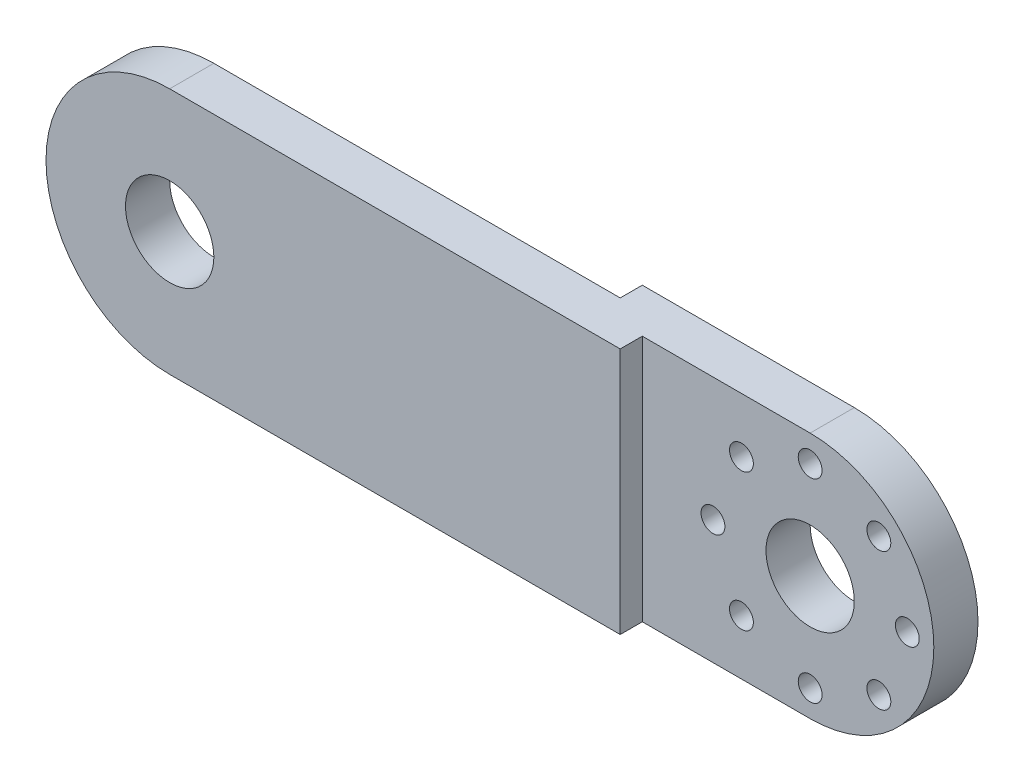
ISO-10303-21;
HEADER;
FILE_DESCRIPTION(('STEP AP214'),'2;1');
FILE_NAME('part.step','',(''),(''),'','','');
FILE_SCHEMA(('AUTOMOTIVE_DESIGN { 1 0 10303 214 1 1 1 1 }'));
ENDSEC;
DATA;
#1=APPLICATION_CONTEXT('core data for automotive mechanical design processes');
#2=APPLICATION_PROTOCOL_DEFINITION('international standard','automotive_design',2000,#1);
#3=PRODUCT_CONTEXT('',#1,'mechanical');
#4=PRODUCT('Part','Part','',(#3));
#5=PRODUCT_RELATED_PRODUCT_CATEGORY('part','',(#4));
#6=PRODUCT_DEFINITION_FORMATION('','',#4);
#7=PRODUCT_DEFINITION_CONTEXT('part definition',#1,'design');
#8=PRODUCT_DEFINITION('design','',#6,#7);
#9=PRODUCT_DEFINITION_SHAPE('','',#8);
#10=(LENGTH_UNIT() NAMED_UNIT(*) SI_UNIT(.MILLI.,.METRE.));
#11=(NAMED_UNIT(*) PLANE_ANGLE_UNIT() SI_UNIT($,.RADIAN.));
#12=(NAMED_UNIT(*) SI_UNIT($,.STERADIAN.) SOLID_ANGLE_UNIT());
#13=UNCERTAINTY_MEASURE_WITH_UNIT(LENGTH_MEASURE(1.E-05),#10,'distance_accuracy_value','');
#14=(GEOMETRIC_REPRESENTATION_CONTEXT(3) GLOBAL_UNCERTAINTY_ASSIGNED_CONTEXT((#13)) GLOBAL_UNIT_ASSIGNED_CONTEXT((#10,
#11,#12)) REPRESENTATION_CONTEXT('',''));
#15=CARTESIAN_POINT('',(0.,0.,0.));
#16=DIRECTION('',(0.,0.,1.));
#17=DIRECTION('',(1.,0.,0.));
#18=AXIS2_PLACEMENT_3D('',#15,#16,#17);
#19=CARTESIAN_POINT('',(0.,0.,5.));
#20=DIRECTION('',(0.,0.,1.));
#21=DIRECTION('',(1.,0.,0.));
#22=AXIS2_PLACEMENT_3D('',#19,#20,#21);
#23=PLANE('',#22);
#24=CARTESIAN_POINT('',(50.,0.,5.));
#25=DIRECTION('',(0.,0.,1.));
#26=DIRECTION('',(1.,0.,0.));
#27=AXIS2_PLACEMENT_3D('',#24,#25,#26);
#28=CIRCLE('',#27,5.);
#29=CARTESIAN_POINT('',(55.,0.,5.));
#30=VERTEX_POINT('',#29);
#31=EDGE_CURVE('E376',#30,#30,#28,.T.);
#32=ORIENTED_EDGE('',*,*,#31,.F.);
#33=EDGE_LOOP('',(#32));
#34=FACE_BOUND('',#33,.T.);
#35=CARTESIAN_POINT('',(50.,0.,5.));
#36=DIRECTION('',(0.,0.,1.));
#37=DIRECTION('',(1.,0.,0.));
#38=AXIS2_PLACEMENT_3D('',#35,#36,#37);
#39=CIRCLE('',#38,14.);
#40=CARTESIAN_POINT('',(50.,14.,5.));
#41=VERTEX_POINT('',#40);
#42=CARTESIAN_POINT('',(50.,-14.,5.));
#43=VERTEX_POINT('',#42);
#44=EDGE_CURVE('E96',#41,#43,#39,.T.);
#45=ORIENTED_EDGE('',*,*,#44,.T.);
#46=DIRECTION('',(1.,0.,0.));
#47=VECTOR('',#46,1.);
#48=CARTESIAN_POINT('',(0.,-14.,5.));
#49=LINE('',#48,#47);
#50=CARTESIAN_POINT('',(101.,-14.,5.));
#51=VERTEX_POINT('',#50);
#52=EDGE_CURVE('E90',#43,#51,#49,.T.);
#53=ORIENTED_EDGE('',*,*,#52,.T.);
#54=DIRECTION('',(0.,-1.,0.));
#55=VECTOR('',#54,1.);
#56=CARTESIAN_POINT('',(101.,14.,5.));
#57=LINE('',#56,#55);
#58=CARTESIAN_POINT('',(101.,14.,5.));
#59=VERTEX_POINT('',#58);
#60=EDGE_CURVE('E92',#59,#51,#57,.T.);
#61=ORIENTED_EDGE('',*,*,#60,.F.);
#62=DIRECTION('',(-1.,0.,0.));
#63=VECTOR('',#62,1.);
#64=CARTESIAN_POINT('',(0.,14.,5.));
#65=LINE('',#64,#63);
#66=EDGE_CURVE('E48',#59,#41,#65,.T.);
#67=ORIENTED_EDGE('',*,*,#66,.T.);
#68=EDGE_LOOP('',(#45,#53,#61,#67));
#69=FACE_BOUND('',#68,.T.);
#70=ADVANCED_FACE('F38',(#34,#69),#23,.T.);
#71=CARTESIAN_POINT('',(0.,0.,0.));
#72=DIRECTION('',(0.,0.,1.));
#73=DIRECTION('',(1.,0.,0.));
#74=AXIS2_PLACEMENT_3D('',#71,#72,#73);
#75=PLANE('',#74);
#76=CARTESIAN_POINT('',(50.,0.,0.));
#77=DIRECTION('',(0.,0.,-1.));
#78=DIRECTION('',(-1.,0.,0.));
#79=AXIS2_PLACEMENT_3D('',#76,#77,#78);
#80=CIRCLE('',#79,5.);
#81=CARTESIAN_POINT('',(45.,0.,0.));
#82=VERTEX_POINT('',#81);
#83=EDGE_CURVE('E379',#82,#82,#80,.T.);
#84=ORIENTED_EDGE('',*,*,#83,.F.);
#85=EDGE_LOOP('',(#84));
#86=FACE_BOUND('',#85,.T.);
#87=DIRECTION('',(1.,0.,0.));
#88=VECTOR('',#87,1.);
#89=CARTESIAN_POINT('',(0.,-14.,0.));
#90=LINE('',#89,#88);
#91=CARTESIAN_POINT('',(50.,-14.,0.));
#92=VERTEX_POINT('',#91);
#93=CARTESIAN_POINT('',(96.,-14.,0.));
#94=VERTEX_POINT('',#93);
#95=EDGE_CURVE('E184',#92,#94,#90,.T.);
#96=ORIENTED_EDGE('',*,*,#95,.F.);
#97=CARTESIAN_POINT('',(50.,0.,0.));
#98=DIRECTION('',(0.,0.,1.));
#99=DIRECTION('',(1.,0.,0.));
#100=AXIS2_PLACEMENT_3D('',#97,#98,#99);
#101=CIRCLE('',#100,14.);
#102=CARTESIAN_POINT('',(50.,14.,0.));
#103=VERTEX_POINT('',#102);
#104=EDGE_CURVE('E287',#103,#92,#101,.T.);
#105=ORIENTED_EDGE('',*,*,#104,.F.);
#106=DIRECTION('',(-1.,0.,0.));
#107=VECTOR('',#106,1.);
#108=CARTESIAN_POINT('',(0.,14.,0.));
#109=LINE('',#108,#107);
#110=CARTESIAN_POINT('',(96.,14.,0.));
#111=VERTEX_POINT('',#110);
#112=EDGE_CURVE('E100',#111,#103,#109,.T.);
#113=ORIENTED_EDGE('',*,*,#112,.F.);
#114=DIRECTION('',(0.,-1.,0.));
#115=VECTOR('',#114,1.);
#116=CARTESIAN_POINT('',(96.,14.,0.));
#117=LINE('',#116,#115);
#118=EDGE_CURVE('E118',#111,#94,#117,.T.);
#119=ORIENTED_EDGE('',*,*,#118,.T.);
#120=EDGE_LOOP('',(#96,#105,#113,#119));
#121=FACE_BOUND('',#120,.T.);
#122=ADVANCED_FACE('F247',(#86,#121),#75,.F.);
#123=CARTESIAN_POINT('',(0.,-14.,5.));
#124=DIRECTION('',(0.,1.,0.));
#125=DIRECTION('',(0.,0.,1.));
#126=AXIS2_PLACEMENT_3D('',#123,#124,#125);
#127=PLANE('',#126);
#128=DIRECTION('',(0.,0.,-1.));
#129=VECTOR('',#128,1.);
#130=CARTESIAN_POINT('',(50.,-14.,10.));
#131=LINE('',#130,#129);
#132=EDGE_CURVE('E11',#92,#43,#131,.F.);
#133=ORIENTED_EDGE('',*,*,#132,.F.);
#134=ORIENTED_EDGE('',*,*,#95,.T.);
#135=DIRECTION('',(0.,0.,-1.));
#136=VECTOR('',#135,1.);
#137=CARTESIAN_POINT('',(96.,-14.,-2.5));
#138=LINE('',#137,#136);
#139=CARTESIAN_POINT('',(96.,-14.,-2.5));
#140=VERTEX_POINT('',#139);
#141=EDGE_CURVE('E299',#94,#140,#138,.T.);
#142=ORIENTED_EDGE('',*,*,#141,.T.);
#143=DIRECTION('',(-1.,0.,0.));
#144=VECTOR('',#143,1.);
#145=CARTESIAN_POINT('',(101.,-14.,-2.5));
#146=LINE('',#145,#144);
#147=CARTESIAN_POINT('',(120.,-14.,-2.5));
#148=VERTEX_POINT('',#147);
#149=EDGE_CURVE('E177',#148,#140,#146,.T.);
#150=ORIENTED_EDGE('',*,*,#149,.F.);
#151=DIRECTION('',(0.,0.,-1.));
#152=VECTOR('',#151,1.);
#153=CARTESIAN_POINT('',(120.,-14.,2.5));
#154=LINE('',#153,#152);
#155=CARTESIAN_POINT('',(120.,-14.,2.5));
#156=VERTEX_POINT('',#155);
#157=EDGE_CURVE('E56',#156,#148,#154,.T.);
#158=ORIENTED_EDGE('',*,*,#157,.F.);
#159=DIRECTION('',(-1.,0.,0.));
#160=VECTOR('',#159,1.);
#161=CARTESIAN_POINT('',(106.,-14.,2.5));
#162=LINE('',#161,#160);
#163=CARTESIAN_POINT('',(101.,-14.,2.5));
#164=VERTEX_POINT('',#163);
#165=EDGE_CURVE('E110',#156,#164,#162,.T.);
#166=ORIENTED_EDGE('',*,*,#165,.T.);
#167=DIRECTION('',(0.,0.,1.));
#168=VECTOR('',#167,1.);
#169=CARTESIAN_POINT('',(101.,-14.,2.5));
#170=LINE('',#169,#168);
#171=EDGE_CURVE('E104',#164,#51,#170,.T.);
#172=ORIENTED_EDGE('',*,*,#171,.T.);
#173=ORIENTED_EDGE('',*,*,#52,.F.);
#174=EDGE_LOOP('',(#133,#134,#142,#150,#158,#166,#172,#173));
#175=FACE_BOUND('',#174,.T.);
#176=ADVANCED_FACE('F40',(#175),#127,.F.);
#177=CARTESIAN_POINT('',(0.,14.,5.));
#178=DIRECTION('',(0.,-1.,0.));
#179=DIRECTION('',(0.,0.,-1.));
#180=AXIS2_PLACEMENT_3D('',#177,#178,#179);
#181=PLANE('',#180);
#182=ORIENTED_EDGE('',*,*,#112,.T.);
#183=DIRECTION('',(0.,0.,1.));
#184=VECTOR('',#183,1.);
#185=CARTESIAN_POINT('',(50.,14.,-2.5));
#186=LINE('',#185,#184);
#187=EDGE_CURVE('E275',#103,#41,#186,.T.);
#188=ORIENTED_EDGE('',*,*,#187,.T.);
#189=ORIENTED_EDGE('',*,*,#66,.F.);
#190=DIRECTION('',(0.,0.,1.));
#191=VECTOR('',#190,1.);
#192=CARTESIAN_POINT('',(101.,14.,2.5));
#193=LINE('',#192,#191);
#194=CARTESIAN_POINT('',(101.,14.,2.5));
#195=VERTEX_POINT('',#194);
#196=EDGE_CURVE('E77',#195,#59,#193,.T.);
#197=ORIENTED_EDGE('',*,*,#196,.F.);
#198=DIRECTION('',(1.,0.,0.));
#199=VECTOR('',#198,1.);
#200=CARTESIAN_POINT('',(106.,14.,2.5));
#201=LINE('',#200,#199);
#202=CARTESIAN_POINT('',(120.,14.,2.5));
#203=VERTEX_POINT('',#202);
#204=EDGE_CURVE('E161',#195,#203,#201,.T.);
#205=ORIENTED_EDGE('',*,*,#204,.T.);
#206=DIRECTION('',(0.,0.,-1.));
#207=VECTOR('',#206,1.);
#208=CARTESIAN_POINT('',(120.,14.,2.5));
#209=LINE('',#208,#207);
#210=CARTESIAN_POINT('',(120.,14.,-2.5));
#211=VERTEX_POINT('',#210);
#212=EDGE_CURVE('E171',#203,#211,#209,.T.);
#213=ORIENTED_EDGE('',*,*,#212,.T.);
#214=DIRECTION('',(1.,0.,0.));
#215=VECTOR('',#214,1.);
#216=CARTESIAN_POINT('',(106.,14.,-2.5));
#217=LINE('',#216,#215);
#218=CARTESIAN_POINT('',(96.,14.,-2.5));
#219=VERTEX_POINT('',#218);
#220=EDGE_CURVE('E68',#219,#211,#217,.T.);
#221=ORIENTED_EDGE('',*,*,#220,.F.);
#222=DIRECTION('',(0.,0.,-1.));
#223=VECTOR('',#222,1.);
#224=CARTESIAN_POINT('',(96.,14.,-2.5));
#225=LINE('',#224,#223);
#226=EDGE_CURVE('E278',#111,#219,#225,.T.);
#227=ORIENTED_EDGE('',*,*,#226,.F.);
#228=EDGE_LOOP('',(#182,#188,#189,#197,#205,#213,#221,#227));
#229=FACE_BOUND('',#228,.T.);
#230=ADVANCED_FACE('F260',(#229),#181,.F.);
#231=CARTESIAN_POINT('',(0.,0.,-2.5));
#232=DIRECTION('',(0.,0.,1.));
#233=DIRECTION('',(1.,0.,0.));
#234=AXIS2_PLACEMENT_3D('',#231,#232,#233);
#235=PLANE('',#234);
#236=CARTESIAN_POINT('',(131.,0.,-2.5));
#237=DIRECTION('',(0.,0.,-1.));
#238=DIRECTION('',(-1.,0.,0.));
#239=AXIS2_PLACEMENT_3D('',#236,#237,#238);
#240=CIRCLE('',#239,1.34999999999998);
#241=CARTESIAN_POINT('',(129.65,0.,-2.5));
#242=VERTEX_POINT('',#241);
#243=EDGE_CURVE('E129',#242,#242,#240,.T.);
#244=ORIENTED_EDGE('',*,*,#243,.F.);
#245=EDGE_LOOP('',(#244));
#246=FACE_BOUND('',#245,.T.);
#247=CARTESIAN_POINT('',(120.,-11.,-2.5));
#248=DIRECTION('',(0.,0.,-1.));
#249=DIRECTION('',(-1.,0.,0.));
#250=AXIS2_PLACEMENT_3D('',#247,#248,#249);
#251=CIRCLE('',#250,1.35000000000001);
#252=CARTESIAN_POINT('',(118.65,-11.,-2.5));
#253=VERTEX_POINT('',#252);
#254=EDGE_CURVE('E141',#253,#253,#251,.T.);
#255=ORIENTED_EDGE('',*,*,#254,.F.);
#256=EDGE_LOOP('',(#255));
#257=FACE_BOUND('',#256,.T.);
#258=CARTESIAN_POINT('',(109.,0.,-2.5));
#259=DIRECTION('',(0.,0.,-1.));
#260=DIRECTION('',(-1.,0.,0.));
#261=AXIS2_PLACEMENT_3D('',#258,#259,#260);
#262=CIRCLE('',#261,1.35000000000001);
#263=CARTESIAN_POINT('',(107.65,0.,-2.5));
#264=VERTEX_POINT('',#263);
#265=EDGE_CURVE('E145',#264,#264,#262,.T.);
#266=ORIENTED_EDGE('',*,*,#265,.F.);
#267=EDGE_LOOP('',(#266));
#268=FACE_BOUND('',#267,.T.);
#269=CARTESIAN_POINT('',(120.,11.,-2.5));
#270=DIRECTION('',(0.,0.,-1.));
#271=DIRECTION('',(-1.,0.,0.));
#272=AXIS2_PLACEMENT_3D('',#269,#270,#271);
#273=CIRCLE('',#272,1.35000000000001);
#274=CARTESIAN_POINT('',(118.65,11.,-2.5));
#275=VERTEX_POINT('',#274);
#276=EDGE_CURVE('E149',#275,#275,#273,.T.);
#277=ORIENTED_EDGE('',*,*,#276,.F.);
#278=EDGE_LOOP('',(#277));
#279=FACE_BOUND('',#278,.T.);
#280=CARTESIAN_POINT('',(112.221825406948,7.77817459305201,-2.5));
#281=DIRECTION('',(0.,0.,-1.));
#282=DIRECTION('',(-1.,0.,0.));
#283=AXIS2_PLACEMENT_3D('',#280,#281,#282);
#284=CIRCLE('',#283,1.35000000000001);
#285=CARTESIAN_POINT('',(110.871825406948,7.77817459305201,-2.5));
#286=VERTEX_POINT('',#285);
#287=EDGE_CURVE('E125',#286,#286,#284,.T.);
#288=ORIENTED_EDGE('',*,*,#287,.F.);
#289=EDGE_LOOP('',(#288));
#290=FACE_BOUND('',#289,.T.);
#291=CARTESIAN_POINT('',(112.221825406948,-7.77817459305183,-2.5));
#292=DIRECTION('',(0.,0.,-1.));
#293=DIRECTION('',(-1.,0.,0.));
#294=AXIS2_PLACEMENT_3D('',#291,#292,#293);
#295=CIRCLE('',#294,1.35000000000001);
#296=CARTESIAN_POINT('',(110.871825406948,-7.77817459305183,-2.5));
#297=VERTEX_POINT('',#296);
#298=EDGE_CURVE('E130',#297,#297,#295,.T.);
#299=ORIENTED_EDGE('',*,*,#298,.F.);
#300=EDGE_LOOP('',(#299));
#301=FACE_BOUND('',#300,.T.);
#302=CARTESIAN_POINT('',(127.778174593052,-7.77817459305202,-2.5));
#303=DIRECTION('',(0.,0.,-1.));
#304=DIRECTION('',(-1.,0.,0.));
#305=AXIS2_PLACEMENT_3D('',#302,#303,#304);
#306=CIRCLE('',#305,1.34999999999998);
#307=CARTESIAN_POINT('',(126.428174593052,-7.77817459305202,-2.5));
#308=VERTEX_POINT('',#307);
#309=EDGE_CURVE('E134',#308,#308,#306,.T.);
#310=ORIENTED_EDGE('',*,*,#309,.F.);
#311=EDGE_LOOP('',(#310));
#312=FACE_BOUND('',#311,.T.);
#313=CARTESIAN_POINT('',(127.778174593052,7.77817459305201,-2.5));
#314=DIRECTION('',(0.,0.,-1.));
#315=DIRECTION('',(-1.,0.,0.));
#316=AXIS2_PLACEMENT_3D('',#313,#314,#315);
#317=CIRCLE('',#316,1.34999999999998);
#318=CARTESIAN_POINT('',(126.428174593052,7.77817459305201,-2.5));
#319=VERTEX_POINT('',#318);
#320=EDGE_CURVE('E124',#319,#319,#317,.T.);
#321=ORIENTED_EDGE('',*,*,#320,.F.);
#322=EDGE_LOOP('',(#321));
#323=FACE_BOUND('',#322,.T.);
#324=CARTESIAN_POINT('',(120.,0.,-2.5));
#325=DIRECTION('',(0.,0.,-1.));
#326=DIRECTION('',(-1.,0.,0.));
#327=AXIS2_PLACEMENT_3D('',#324,#325,#326);
#328=CIRCLE('',#327,5.);
#329=CARTESIAN_POINT('',(115.,0.,-2.5));
#330=VERTEX_POINT('',#329);
#331=EDGE_CURVE('E153',#330,#330,#328,.T.);
#332=ORIENTED_EDGE('',*,*,#331,.F.);
#333=EDGE_LOOP('',(#332));
#334=FACE_BOUND('',#333,.T.);
#335=ORIENTED_EDGE('',*,*,#220,.T.);
#336=CARTESIAN_POINT('',(120.,0.,-2.5));
#337=DIRECTION('',(0.,0.,-1.));
#338=DIRECTION('',(-1.,0.,0.));
#339=AXIS2_PLACEMENT_3D('',#336,#337,#338);
#340=CIRCLE('',#339,14.);
#341=EDGE_CURVE('E166',#211,#148,#340,.T.);
#342=ORIENTED_EDGE('',*,*,#341,.T.);
#343=ORIENTED_EDGE('',*,*,#149,.T.);
#344=DIRECTION('',(0.,-1.,0.));
#345=VECTOR('',#344,1.);
#346=CARTESIAN_POINT('',(96.,14.,-2.5));
#347=LINE('',#346,#345);
#348=EDGE_CURVE('E112',#219,#140,#347,.T.);
#349=ORIENTED_EDGE('',*,*,#348,.F.);
#350=EDGE_LOOP('',(#335,#342,#343,#349));
#351=FACE_BOUND('',#350,.T.);
#352=ADVANCED_FACE('F258',(#246,#257,#268,#279,#290,#301,#312,#323,#334,#351),#235,.F.);
#353=CARTESIAN_POINT('',(120.,0.,2.5));
#354=DIRECTION('',(0.,0.,-1.));
#355=DIRECTION('',(-1.,0.,0.));
#356=AXIS2_PLACEMENT_3D('',#353,#354,#355);
#357=CYLINDRICAL_SURFACE('',#356,14.);
#358=ORIENTED_EDGE('',*,*,#341,.F.);
#359=ORIENTED_EDGE('',*,*,#212,.F.);
#360=CARTESIAN_POINT('',(120.,0.,2.5));
#361=DIRECTION('',(0.,0.,-1.));
#362=DIRECTION('',(-1.,0.,0.));
#363=AXIS2_PLACEMENT_3D('',#360,#361,#362);
#364=CIRCLE('',#363,14.);
#365=EDGE_CURVE('E165',#203,#156,#364,.T.);
#366=ORIENTED_EDGE('',*,*,#365,.T.);
#367=ORIENTED_EDGE('',*,*,#157,.T.);
#368=EDGE_LOOP('',(#358,#359,#366,#367));
#369=FACE_BOUND('',#368,.T.);
#370=ADVANCED_FACE('F267',(#369),#357,.T.);
#371=CARTESIAN_POINT('',(120.,0.,2.5));
#372=DIRECTION('',(0.,0.,-1.));
#373=DIRECTION('',(-1.,0.,0.));
#374=AXIS2_PLACEMENT_3D('',#371,#372,#373);
#375=PLANE('',#374);
#376=CARTESIAN_POINT('',(131.,0.,2.5));
#377=DIRECTION('',(0.,0.,-1.));
#378=DIRECTION('',(-1.,0.,0.));
#379=AXIS2_PLACEMENT_3D('',#376,#377,#378);
#380=CIRCLE('',#379,1.34999999999998);
#381=CARTESIAN_POINT('',(129.65,0.,2.5));
#382=VERTEX_POINT('',#381);
#383=EDGE_CURVE('E174',#382,#382,#380,.T.);
#384=ORIENTED_EDGE('',*,*,#383,.T.);
#385=EDGE_LOOP('',(#384));
#386=FACE_BOUND('',#385,.T.);
#387=CARTESIAN_POINT('',(120.,-11.,2.5));
#388=DIRECTION('',(0.,0.,-1.));
#389=DIRECTION('',(-1.,0.,0.));
#390=AXIS2_PLACEMENT_3D('',#387,#388,#389);
#391=CIRCLE('',#390,1.35000000000001);
#392=CARTESIAN_POINT('',(118.65,-11.,2.5));
#393=VERTEX_POINT('',#392);
#394=EDGE_CURVE('E221',#393,#393,#391,.T.);
#395=ORIENTED_EDGE('',*,*,#394,.T.);
#396=EDGE_LOOP('',(#395));
#397=FACE_BOUND('',#396,.T.);
#398=CARTESIAN_POINT('',(109.,0.,2.5));
#399=DIRECTION('',(0.,0.,-1.));
#400=DIRECTION('',(-1.,0.,0.));
#401=AXIS2_PLACEMENT_3D('',#398,#399,#400);
#402=CIRCLE('',#401,1.35000000000001);
#403=CARTESIAN_POINT('',(107.65,0.,2.5));
#404=VERTEX_POINT('',#403);
#405=EDGE_CURVE('E217',#404,#404,#402,.T.);
#406=ORIENTED_EDGE('',*,*,#405,.T.);
#407=EDGE_LOOP('',(#406));
#408=FACE_BOUND('',#407,.T.);
#409=CARTESIAN_POINT('',(120.,11.,2.5));
#410=DIRECTION('',(0.,0.,-1.));
#411=DIRECTION('',(-1.,0.,0.));
#412=AXIS2_PLACEMENT_3D('',#409,#410,#411);
#413=CIRCLE('',#412,1.35000000000001);
#414=CARTESIAN_POINT('',(118.65,11.,2.5));
#415=VERTEX_POINT('',#414);
#416=EDGE_CURVE('E213',#415,#415,#413,.T.);
#417=ORIENTED_EDGE('',*,*,#416,.T.);
#418=EDGE_LOOP('',(#417));
#419=FACE_BOUND('',#418,.T.);
#420=CARTESIAN_POINT('',(112.221825406948,7.77817459305201,2.5));
#421=DIRECTION('',(0.,0.,-1.));
#422=DIRECTION('',(-1.,0.,0.));
#423=AXIS2_PLACEMENT_3D('',#420,#421,#422);
#424=CIRCLE('',#423,1.35000000000001);
#425=CARTESIAN_POINT('',(110.871825406948,7.77817459305201,2.5));
#426=VERTEX_POINT('',#425);
#427=EDGE_CURVE('E209',#426,#426,#424,.T.);
#428=ORIENTED_EDGE('',*,*,#427,.T.);
#429=EDGE_LOOP('',(#428));
#430=FACE_BOUND('',#429,.T.);
#431=CARTESIAN_POINT('',(112.221825406948,-7.77817459305183,2.5));
#432=DIRECTION('',(0.,0.,-1.));
#433=DIRECTION('',(-1.,0.,0.));
#434=AXIS2_PLACEMENT_3D('',#431,#432,#433);
#435=CIRCLE('',#434,1.35000000000001);
#436=CARTESIAN_POINT('',(110.871825406948,-7.77817459305183,2.5));
#437=VERTEX_POINT('',#436);
#438=EDGE_CURVE('E205',#437,#437,#435,.T.);
#439=ORIENTED_EDGE('',*,*,#438,.T.);
#440=EDGE_LOOP('',(#439));
#441=FACE_BOUND('',#440,.T.);
#442=CARTESIAN_POINT('',(127.778174593052,-7.77817459305202,2.5));
#443=DIRECTION('',(0.,0.,-1.));
#444=DIRECTION('',(-1.,0.,0.));
#445=AXIS2_PLACEMENT_3D('',#442,#443,#444);
#446=CIRCLE('',#445,1.34999999999998);
#447=CARTESIAN_POINT('',(126.428174593052,-7.77817459305202,2.5));
#448=VERTEX_POINT('',#447);
#449=EDGE_CURVE('E201',#448,#448,#446,.T.);
#450=ORIENTED_EDGE('',*,*,#449,.T.);
#451=EDGE_LOOP('',(#450));
#452=FACE_BOUND('',#451,.T.);
#453=CARTESIAN_POINT('',(127.778174593052,7.77817459305201,2.5));
#454=DIRECTION('',(0.,0.,-1.));
#455=DIRECTION('',(-1.,0.,0.));
#456=AXIS2_PLACEMENT_3D('',#453,#454,#455);
#457=CIRCLE('',#456,1.34999999999998);
#458=CARTESIAN_POINT('',(126.428174593052,7.77817459305201,2.5));
#459=VERTEX_POINT('',#458);
#460=EDGE_CURVE('E197',#459,#459,#457,.T.);
#461=ORIENTED_EDGE('',*,*,#460,.T.);
#462=EDGE_LOOP('',(#461));
#463=FACE_BOUND('',#462,.T.);
#464=CARTESIAN_POINT('',(120.,0.,2.5));
#465=DIRECTION('',(0.,0.,-1.));
#466=DIRECTION('',(-1.,0.,0.));
#467=AXIS2_PLACEMENT_3D('',#464,#465,#466);
#468=CIRCLE('',#467,5.);
#469=CARTESIAN_POINT('',(115.,0.,2.5));
#470=VERTEX_POINT('',#469);
#471=EDGE_CURVE('E160',#470,#470,#468,.T.);
#472=ORIENTED_EDGE('',*,*,#471,.T.);
#473=EDGE_LOOP('',(#472));
#474=FACE_BOUND('',#473,.T.);
#475=ORIENTED_EDGE('',*,*,#204,.F.);
#476=DIRECTION('',(0.,-1.,0.));
#477=VECTOR('',#476,1.);
#478=CARTESIAN_POINT('',(101.,14.,2.5));
#479=LINE('',#478,#477);
#480=EDGE_CURVE('E107',#195,#164,#479,.T.);
#481=ORIENTED_EDGE('',*,*,#480,.T.);
#482=ORIENTED_EDGE('',*,*,#165,.F.);
#483=ORIENTED_EDGE('',*,*,#365,.F.);
#484=EDGE_LOOP('',(#475,#481,#482,#483));
#485=FACE_BOUND('',#484,.T.);
#486=ADVANCED_FACE('F228',(#386,#397,#408,#419,#430,#441,#452,#463,#474,#485),#375,.F.);
#487=CARTESIAN_POINT('',(120.,0.,5.));
#488=DIRECTION('',(0.,0.,-1.));
#489=DIRECTION('',(-1.,0.,0.));
#490=AXIS2_PLACEMENT_3D('',#487,#488,#489);
#491=CYLINDRICAL_SURFACE('',#490,5.);
#492=ORIENTED_EDGE('',*,*,#331,.T.);
#493=EDGE_LOOP('',(#492));
#494=FACE_BOUND('',#493,.T.);
#495=ORIENTED_EDGE('',*,*,#471,.F.);
#496=EDGE_LOOP('',(#495));
#497=FACE_BOUND('',#496,.T.);
#498=ADVANCED_FACE('F314',(#494,#497),#491,.F.);
#499=CARTESIAN_POINT('',(127.778174593052,7.77817459305201,5.));
#500=DIRECTION('',(0.,0.,-1.));
#501=DIRECTION('',(-1.,0.,0.));
#502=AXIS2_PLACEMENT_3D('',#499,#500,#501);
#503=CYLINDRICAL_SURFACE('',#502,1.34999999999998);
#504=ORIENTED_EDGE('',*,*,#320,.T.);
#505=EDGE_LOOP('',(#504));
#506=FACE_BOUND('',#505,.T.);
#507=ORIENTED_EDGE('',*,*,#460,.F.);
#508=EDGE_LOOP('',(#507));
#509=FACE_BOUND('',#508,.T.);
#510=ADVANCED_FACE('F320',(#506,#509),#503,.F.);
#511=CARTESIAN_POINT('',(127.778174593052,-7.77817459305202,5.));
#512=DIRECTION('',(0.,0.,-1.));
#513=DIRECTION('',(-1.,0.,0.));
#514=AXIS2_PLACEMENT_3D('',#511,#512,#513);
#515=CYLINDRICAL_SURFACE('',#514,1.34999999999998);
#516=ORIENTED_EDGE('',*,*,#309,.T.);
#517=EDGE_LOOP('',(#516));
#518=FACE_BOUND('',#517,.T.);
#519=ORIENTED_EDGE('',*,*,#449,.F.);
#520=EDGE_LOOP('',(#519));
#521=FACE_BOUND('',#520,.T.);
#522=ADVANCED_FACE('F353',(#518,#521),#515,.F.);
#523=CARTESIAN_POINT('',(112.221825406948,-7.77817459305183,5.));
#524=DIRECTION('',(0.,0.,-1.));
#525=DIRECTION('',(-1.,0.,0.));
#526=AXIS2_PLACEMENT_3D('',#523,#524,#525);
#527=CYLINDRICAL_SURFACE('',#526,1.35000000000001);
#528=ORIENTED_EDGE('',*,*,#298,.T.);
#529=EDGE_LOOP('',(#528));
#530=FACE_BOUND('',#529,.T.);
#531=ORIENTED_EDGE('',*,*,#438,.F.);
#532=EDGE_LOOP('',(#531));
#533=FACE_BOUND('',#532,.T.);
#534=ADVANCED_FACE('F333',(#530,#533),#527,.F.);
#535=CARTESIAN_POINT('',(112.221825406948,7.77817459305201,5.));
#536=DIRECTION('',(0.,0.,-1.));
#537=DIRECTION('',(-1.,0.,0.));
#538=AXIS2_PLACEMENT_3D('',#535,#536,#537);
#539=CYLINDRICAL_SURFACE('',#538,1.35000000000001);
#540=ORIENTED_EDGE('',*,*,#287,.T.);
#541=EDGE_LOOP('',(#540));
#542=FACE_BOUND('',#541,.T.);
#543=ORIENTED_EDGE('',*,*,#427,.F.);
#544=EDGE_LOOP('',(#543));
#545=FACE_BOUND('',#544,.T.);
#546=ADVANCED_FACE('F328',(#542,#545),#539,.F.);
#547=CARTESIAN_POINT('',(120.,11.,5.));
#548=DIRECTION('',(0.,0.,-1.));
#549=DIRECTION('',(-1.,0.,0.));
#550=AXIS2_PLACEMENT_3D('',#547,#548,#549);
#551=CYLINDRICAL_SURFACE('',#550,1.35000000000001);
#552=ORIENTED_EDGE('',*,*,#276,.T.);
#553=EDGE_LOOP('',(#552));
#554=FACE_BOUND('',#553,.T.);
#555=ORIENTED_EDGE('',*,*,#416,.F.);
#556=EDGE_LOOP('',(#555));
#557=FACE_BOUND('',#556,.T.);
#558=ADVANCED_FACE('F325',(#554,#557),#551,.F.);
#559=CARTESIAN_POINT('',(109.,0.,5.));
#560=DIRECTION('',(0.,0.,-1.));
#561=DIRECTION('',(-1.,0.,0.));
#562=AXIS2_PLACEMENT_3D('',#559,#560,#561);
#563=CYLINDRICAL_SURFACE('',#562,1.35000000000001);
#564=ORIENTED_EDGE('',*,*,#265,.T.);
#565=EDGE_LOOP('',(#564));
#566=FACE_BOUND('',#565,.T.);
#567=ORIENTED_EDGE('',*,*,#405,.F.);
#568=EDGE_LOOP('',(#567));
#569=FACE_BOUND('',#568,.T.);
#570=ADVANCED_FACE('F242',(#566,#569),#563,.F.);
#571=CARTESIAN_POINT('',(120.,-11.,5.));
#572=DIRECTION('',(0.,0.,-1.));
#573=DIRECTION('',(-1.,0.,0.));
#574=AXIS2_PLACEMENT_3D('',#571,#572,#573);
#575=CYLINDRICAL_SURFACE('',#574,1.35000000000001);
#576=ORIENTED_EDGE('',*,*,#254,.T.);
#577=EDGE_LOOP('',(#576));
#578=FACE_BOUND('',#577,.T.);
#579=ORIENTED_EDGE('',*,*,#394,.F.);
#580=EDGE_LOOP('',(#579));
#581=FACE_BOUND('',#580,.T.);
#582=ADVANCED_FACE('F233',(#578,#581),#575,.F.);
#583=CARTESIAN_POINT('',(131.,0.,5.));
#584=DIRECTION('',(0.,0.,-1.));
#585=DIRECTION('',(-1.,0.,0.));
#586=AXIS2_PLACEMENT_3D('',#583,#584,#585);
#587=CYLINDRICAL_SURFACE('',#586,1.34999999999998);
#588=ORIENTED_EDGE('',*,*,#243,.T.);
#589=EDGE_LOOP('',(#588));
#590=FACE_BOUND('',#589,.T.);
#591=ORIENTED_EDGE('',*,*,#383,.F.);
#592=EDGE_LOOP('',(#591));
#593=FACE_BOUND('',#592,.T.);
#594=ADVANCED_FACE('F231',(#590,#593),#587,.F.);
#595=CARTESIAN_POINT('',(101.,14.,2.5));
#596=DIRECTION('',(1.,0.,0.));
#597=DIRECTION('',(0.,0.,-1.));
#598=AXIS2_PLACEMENT_3D('',#595,#596,#597);
#599=PLANE('',#598);
#600=ORIENTED_EDGE('',*,*,#171,.F.);
#601=ORIENTED_EDGE('',*,*,#480,.F.);
#602=ORIENTED_EDGE('',*,*,#196,.T.);
#603=ORIENTED_EDGE('',*,*,#60,.T.);
#604=EDGE_LOOP('',(#600,#601,#602,#603));
#605=FACE_BOUND('',#604,.T.);
#606=ADVANCED_FACE('F103',(#605),#599,.T.);
#607=CARTESIAN_POINT('',(96.,14.,-2.5));
#608=DIRECTION('',(-1.,0.,0.));
#609=DIRECTION('',(0.,0.,1.));
#610=AXIS2_PLACEMENT_3D('',#607,#608,#609);
#611=PLANE('',#610);
#612=ORIENTED_EDGE('',*,*,#141,.F.);
#613=ORIENTED_EDGE('',*,*,#118,.F.);
#614=ORIENTED_EDGE('',*,*,#226,.T.);
#615=ORIENTED_EDGE('',*,*,#348,.T.);
#616=EDGE_LOOP('',(#612,#613,#614,#615));
#617=FACE_BOUND('',#616,.T.);
#618=ADVANCED_FACE('F240',(#617),#611,.T.);
#619=CARTESIAN_POINT('',(50.,0.,-2.5));
#620=DIRECTION('',(0.,0.,1.));
#621=DIRECTION('',(1.,0.,0.));
#622=AXIS2_PLACEMENT_3D('',#619,#620,#621);
#623=CYLINDRICAL_SURFACE('',#622,14.);
#624=ORIENTED_EDGE('',*,*,#187,.F.);
#625=ORIENTED_EDGE('',*,*,#104,.T.);
#626=ORIENTED_EDGE('',*,*,#132,.T.);
#627=ORIENTED_EDGE('',*,*,#44,.F.);
#628=EDGE_LOOP('',(#624,#625,#626,#627));
#629=FACE_BOUND('',#628,.T.);
#630=ADVANCED_FACE('F297',(#629),#623,.T.);
#631=CARTESIAN_POINT('',(50.,0.,10.));
#632=DIRECTION('',(0.,0.,-1.));
#633=DIRECTION('',(-1.,0.,0.));
#634=AXIS2_PLACEMENT_3D('',#631,#632,#633);
#635=CYLINDRICAL_SURFACE('',#634,5.);
#636=ORIENTED_EDGE('',*,*,#31,.T.);
#637=EDGE_LOOP('',(#636));
#638=FACE_BOUND('',#637,.T.);
#639=ORIENTED_EDGE('',*,*,#83,.T.);
#640=EDGE_LOOP('',(#639));
#641=FACE_BOUND('',#640,.T.);
#642=ADVANCED_FACE('F369',(#638,#641),#635,.F.);
#643=CLOSED_SHELL('',(#70,#122,#176,#230,#352,#370,#486,#498,#510,#522,#534,#546,#558,#570,#582,
#594,#606,#618,#630,#642));
#644=MANIFOLD_SOLID_BREP('B2',#643);
#645=ADVANCED_BREP_SHAPE_REPRESENTATION('',(#18,#644),#14);
#646=SHAPE_DEFINITION_REPRESENTATION(#9,#645);
ENDSEC;
END-ISO-10303-21;
